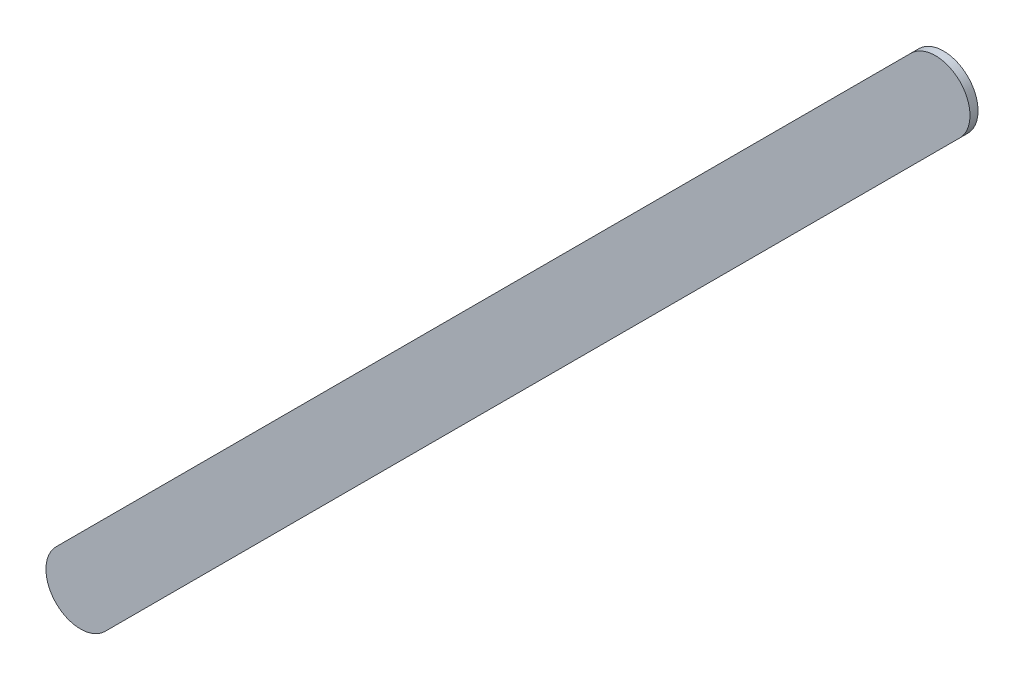
ISO-10303-21;
HEADER;
FILE_DESCRIPTION(('STEP AP214'),'2;1');
FILE_NAME('part.step','',(''),(''),'','','');
FILE_SCHEMA(('AUTOMOTIVE_DESIGN { 1 0 10303 214 1 1 1 1 }'));
ENDSEC;
DATA;
#1=APPLICATION_CONTEXT('core data for automotive mechanical design processes');
#2=APPLICATION_PROTOCOL_DEFINITION('international standard','automotive_design',2000,#1);
#3=PRODUCT_CONTEXT('',#1,'mechanical');
#4=PRODUCT('Part','Part','',(#3));
#5=PRODUCT_RELATED_PRODUCT_CATEGORY('part','',(#4));
#6=PRODUCT_DEFINITION_FORMATION('','',#4);
#7=PRODUCT_DEFINITION_CONTEXT('part definition',#1,'design');
#8=PRODUCT_DEFINITION('design','',#6,#7);
#9=PRODUCT_DEFINITION_SHAPE('','',#8);
#10=(LENGTH_UNIT() NAMED_UNIT(*) SI_UNIT(.MILLI.,.METRE.));
#11=(NAMED_UNIT(*) PLANE_ANGLE_UNIT() SI_UNIT($,.RADIAN.));
#12=(NAMED_UNIT(*) SI_UNIT($,.STERADIAN.) SOLID_ANGLE_UNIT());
#13=UNCERTAINTY_MEASURE_WITH_UNIT(LENGTH_MEASURE(1.E-05),#10,'distance_accuracy_value','');
#14=(GEOMETRIC_REPRESENTATION_CONTEXT(3) GLOBAL_UNCERTAINTY_ASSIGNED_CONTEXT((#13)) GLOBAL_UNIT_ASSIGNED_CONTEXT((#10,
#11,#12)) REPRESENTATION_CONTEXT('',''));
#15=CARTESIAN_POINT('',(0.,0.,0.));
#16=DIRECTION('',(0.,0.,1.));
#17=DIRECTION('',(1.,0.,0.));
#18=AXIS2_PLACEMENT_3D('',#15,#16,#17);
#19=CARTESIAN_POINT('',(129.561933,-119.975933,1.635));
#20=DIRECTION('',(0.,0.,1.));
#21=DIRECTION('',(1.,0.,0.));
#22=AXIS2_PLACEMENT_3D('',#19,#20,#21);
#23=PLANE('',#22);
#24=DIRECTION('',(-0.707106781186548,-0.707106781186548,0.));
#25=VECTOR('',#24,1.);
#26=CARTESIAN_POINT('',(129.561933,-119.975933,1.635));
#27=LINE('',#26,#25);
#28=CARTESIAN_POINT('',(129.561933,-119.975933,1.635));
#29=VERTEX_POINT('',#28);
#30=CARTESIAN_POINT('',(125.853933,-123.683933,1.635));
#31=VERTEX_POINT('',#30);
#32=EDGE_CURVE('E72',#29,#31,#27,.T.);
#33=ORIENTED_EDGE('',*,*,#32,.T.);
#34=CARTESIAN_POINT('',(125.9599995,-123.7899995,1.635));
#35=DIRECTION('',(0.,0.,1.));
#36=DIRECTION('',(-0.707106781186548,0.707106781186548,0.));
#37=AXIS2_PLACEMENT_3D('',#34,#35,#36);
#38=CIRCLE('',#37,0.150000682813);
#39=CARTESIAN_POINT('',(126.066066,-123.896066,1.635));
#40=VERTEX_POINT('',#39);
#41=EDGE_CURVE('E70',#31,#40,#38,.T.);
#42=ORIENTED_EDGE('',*,*,#41,.T.);
#43=DIRECTION('',(0.707106781186548,0.707106781186548,0.));
#44=VECTOR('',#43,1.);
#45=CARTESIAN_POINT('',(126.066066,-123.896066,1.635));
#46=LINE('',#45,#44);
#47=CARTESIAN_POINT('',(129.774066,-120.188066,1.635));
#48=VERTEX_POINT('',#47);
#49=EDGE_CURVE('E58',#40,#48,#46,.T.);
#50=ORIENTED_EDGE('',*,*,#49,.T.);
#51=CARTESIAN_POINT('',(129.6679995,-120.0819995,1.635));
#52=DIRECTION('',(0.,0.,1.));
#53=DIRECTION('',(0.707106781186548,-0.707106781186548,0.));
#54=AXIS2_PLACEMENT_3D('',#51,#52,#53);
#55=CIRCLE('',#54,0.150000682813);
#56=EDGE_CURVE('E11',#48,#29,#55,.T.);
#57=ORIENTED_EDGE('',*,*,#56,.T.);
#58=EDGE_LOOP('',(#33,#42,#50,#57));
#59=FACE_BOUND('',#58,.T.);
#60=ADVANCED_FACE('F17',(#59),#23,.T.);
#61=CARTESIAN_POINT('',(129.561933,-119.975933,1.6));
#62=DIRECTION('',(0.,0.,1.));
#63=DIRECTION('',(1.,0.,0.));
#64=AXIS2_PLACEMENT_3D('',#61,#62,#63);
#65=PLANE('',#64);
#66=CARTESIAN_POINT('',(129.6679995,-120.0819995,1.6));
#67=DIRECTION('',(0.,0.,1.));
#68=DIRECTION('',(0.707106781186548,-0.707106781186548,0.));
#69=AXIS2_PLACEMENT_3D('',#66,#67,#68);
#70=CIRCLE('',#69,0.150000682813);
#71=CARTESIAN_POINT('',(129.774066,-120.188066,1.6));
#72=VERTEX_POINT('',#71);
#73=CARTESIAN_POINT('',(129.561933,-119.975933,1.6));
#74=VERTEX_POINT('',#73);
#75=EDGE_CURVE('E20',#72,#74,#70,.T.);
#76=ORIENTED_EDGE('',*,*,#75,.F.);
#77=DIRECTION('',(0.707106781186548,0.707106781186548,0.));
#78=VECTOR('',#77,1.);
#79=CARTESIAN_POINT('',(126.066066,-123.896066,1.6));
#80=LINE('',#79,#78);
#81=CARTESIAN_POINT('',(126.066066,-123.896066,1.6));
#82=VERTEX_POINT('',#81);
#83=EDGE_CURVE('E77',#82,#72,#80,.T.);
#84=ORIENTED_EDGE('',*,*,#83,.F.);
#85=CARTESIAN_POINT('',(125.9599995,-123.7899995,1.6));
#86=DIRECTION('',(0.,0.,1.));
#87=DIRECTION('',(-0.707106781186548,0.707106781186548,0.));
#88=AXIS2_PLACEMENT_3D('',#85,#86,#87);
#89=CIRCLE('',#88,0.150000682813);
#90=CARTESIAN_POINT('',(125.853933,-123.683933,1.6));
#91=VERTEX_POINT('',#90);
#92=EDGE_CURVE('E81',#91,#82,#89,.T.);
#93=ORIENTED_EDGE('',*,*,#92,.F.);
#94=DIRECTION('',(-0.707106781186548,-0.707106781186548,0.));
#95=VECTOR('',#94,1.);
#96=CARTESIAN_POINT('',(129.561933,-119.975933,1.6));
#97=LINE('',#96,#95);
#98=EDGE_CURVE('E117',#74,#91,#97,.T.);
#99=ORIENTED_EDGE('',*,*,#98,.F.);
#100=EDGE_LOOP('',(#76,#84,#93,#99));
#101=FACE_BOUND('',#100,.T.);
#102=ADVANCED_FACE('F160',(#101),#65,.F.);
#103=CARTESIAN_POINT('',(129.6679995,-120.0819995,1.6));
#104=DIRECTION('',(0.,0.,-1.));
#105=DIRECTION('',(0.707106781186548,-0.707106781186548,0.));
#106=AXIS2_PLACEMENT_3D('',#103,#104,#105);
#107=CYLINDRICAL_SURFACE('',#106,0.150000682813);
#108=ORIENTED_EDGE('',*,*,#75,.T.);
#109=DIRECTION('',(0.,0.,1.));
#110=VECTOR('',#109,1.);
#111=CARTESIAN_POINT('',(129.561933,-119.975933,1.6));
#112=LINE('',#111,#110);
#113=EDGE_CURVE('E88',#74,#29,#112,.T.);
#114=ORIENTED_EDGE('',*,*,#113,.T.);
#115=ORIENTED_EDGE('',*,*,#56,.F.);
#116=DIRECTION('',(0.,0.,1.));
#117=VECTOR('',#116,1.);
#118=CARTESIAN_POINT('',(129.774066,-120.188066,1.6));
#119=LINE('',#118,#117);
#120=EDGE_CURVE('E65',#72,#48,#119,.T.);
#121=ORIENTED_EDGE('',*,*,#120,.F.);
#122=EDGE_LOOP('',(#108,#114,#115,#121));
#123=FACE_BOUND('',#122,.T.);
#124=ADVANCED_FACE('F109',(#123),#107,.T.);
#125=CARTESIAN_POINT('',(126.066066,-123.896066,1.6));
#126=DIRECTION('',(-0.707106781186548,0.707106781186548,0.));
#127=DIRECTION('',(0.,0.,1.));
#128=AXIS2_PLACEMENT_3D('',#125,#126,#127);
#129=PLANE('',#128);
#130=ORIENTED_EDGE('',*,*,#83,.T.);
#131=ORIENTED_EDGE('',*,*,#120,.T.);
#132=ORIENTED_EDGE('',*,*,#49,.F.);
#133=DIRECTION('',(0.,0.,1.));
#134=VECTOR('',#133,1.);
#135=CARTESIAN_POINT('',(126.066066,-123.896066,1.6));
#136=LINE('',#135,#134);
#137=EDGE_CURVE('E63',#82,#40,#136,.T.);
#138=ORIENTED_EDGE('',*,*,#137,.F.);
#139=EDGE_LOOP('',(#130,#131,#132,#138));
#140=FACE_BOUND('',#139,.T.);
#141=ADVANCED_FACE('F61',(#140),#129,.F.);
#142=CARTESIAN_POINT('',(125.9599995,-123.7899995,1.6));
#143=DIRECTION('',(0.,0.,-1.));
#144=DIRECTION('',(-0.707106781186548,0.707106781186548,0.));
#145=AXIS2_PLACEMENT_3D('',#142,#143,#144);
#146=CYLINDRICAL_SURFACE('',#145,0.150000682813);
#147=ORIENTED_EDGE('',*,*,#92,.T.);
#148=ORIENTED_EDGE('',*,*,#137,.T.);
#149=ORIENTED_EDGE('',*,*,#41,.F.);
#150=DIRECTION('',(0.,0.,1.));
#151=VECTOR('',#150,1.);
#152=CARTESIAN_POINT('',(125.853933,-123.683933,1.6));
#153=LINE('',#152,#151);
#154=EDGE_CURVE('E101',#91,#31,#153,.T.);
#155=ORIENTED_EDGE('',*,*,#154,.F.);
#156=EDGE_LOOP('',(#147,#148,#149,#155));
#157=FACE_BOUND('',#156,.T.);
#158=ADVANCED_FACE('F79',(#157),#146,.T.);
#159=CARTESIAN_POINT('',(129.561933,-119.975933,1.6));
#160=DIRECTION('',(0.707106781186548,-0.707106781186548,0.));
#161=DIRECTION('',(0.,0.,-1.));
#162=AXIS2_PLACEMENT_3D('',#159,#160,#161);
#163=PLANE('',#162);
#164=ORIENTED_EDGE('',*,*,#98,.T.);
#165=ORIENTED_EDGE('',*,*,#154,.T.);
#166=ORIENTED_EDGE('',*,*,#32,.F.);
#167=ORIENTED_EDGE('',*,*,#113,.F.);
#168=EDGE_LOOP('',(#164,#165,#166,#167));
#169=FACE_BOUND('',#168,.T.);
#170=ADVANCED_FACE('F116',(#169),#163,.F.);
#171=CLOSED_SHELL('',(#60,#102,#124,#141,#158,#170));
#172=MANIFOLD_SOLID_BREP('B1',#171);
#173=ADVANCED_BREP_SHAPE_REPRESENTATION('',(#18,#172),#14);
#174=SHAPE_DEFINITION_REPRESENTATION(#9,#173);
ENDSEC;
END-ISO-10303-21;
